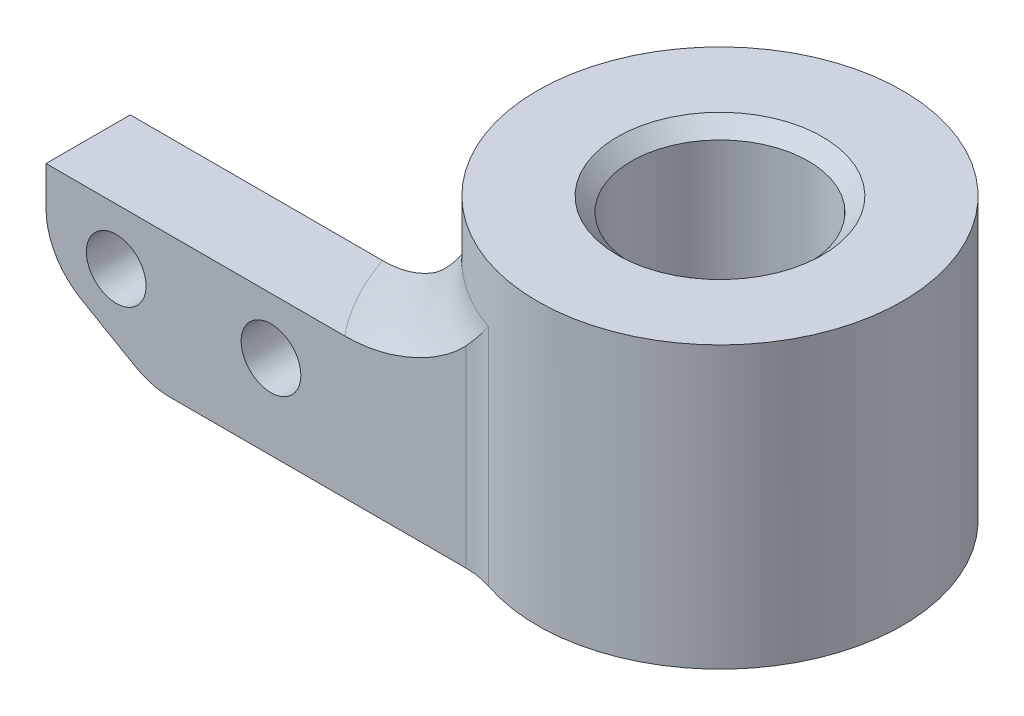
ISO-10303-21;
HEADER;
FILE_DESCRIPTION(('STEP AP214'),'2;1');
FILE_NAME('part.step','',(''),(''),'','','');
FILE_SCHEMA(('AUTOMOTIVE_DESIGN { 1 0 10303 214 1 1 1 1 }'));
ENDSEC;
DATA;
#1=APPLICATION_CONTEXT('core data for automotive mechanical design processes');
#2=APPLICATION_PROTOCOL_DEFINITION('international standard','automotive_design',2000,#1);
#3=PRODUCT_CONTEXT('',#1,'mechanical');
#4=PRODUCT('Part','Part','',(#3));
#5=PRODUCT_RELATED_PRODUCT_CATEGORY('part','',(#4));
#6=PRODUCT_DEFINITION_FORMATION('','',#4);
#7=PRODUCT_DEFINITION_CONTEXT('part definition',#1,'design');
#8=PRODUCT_DEFINITION('design','',#6,#7);
#9=PRODUCT_DEFINITION_SHAPE('','',#8);
#10=(LENGTH_UNIT() NAMED_UNIT(*) SI_UNIT(.MILLI.,.METRE.));
#11=(NAMED_UNIT(*) PLANE_ANGLE_UNIT() SI_UNIT($,.RADIAN.));
#12=(NAMED_UNIT(*) SI_UNIT($,.STERADIAN.) SOLID_ANGLE_UNIT());
#13=UNCERTAINTY_MEASURE_WITH_UNIT(LENGTH_MEASURE(1.E-05),#10,'distance_accuracy_value','');
#14=(GEOMETRIC_REPRESENTATION_CONTEXT(3) GLOBAL_UNCERTAINTY_ASSIGNED_CONTEXT((#13)) GLOBAL_UNIT_ASSIGNED_CONTEXT((#10,
#11,#12)) REPRESENTATION_CONTEXT('',''));
#15=CARTESIAN_POINT('',(0.,0.,0.));
#16=DIRECTION('',(0.,0.,1.));
#17=DIRECTION('',(1.,0.,0.));
#18=AXIS2_PLACEMENT_3D('',#15,#16,#17);
#19=CARTESIAN_POINT('',(0.,6.35,0.));
#20=DIRECTION('',(0.,-1.,0.));
#21=DIRECTION('',(0.,0.,-1.));
#22=AXIS2_PLACEMENT_3D('',#19,#20,#21);
#23=CYLINDRICAL_SURFACE('',#22,8.255);
#24=CARTESIAN_POINT('',(0.,6.35,0.));
#25=DIRECTION('',(0.,1.,0.));
#26=DIRECTION('',(0.,0.,1.));
#27=AXIS2_PLACEMENT_3D('',#24,#25,#26);
#28=CIRCLE('',#27,8.255);
#29=CARTESIAN_POINT('',(0.,6.35,8.255));
#30=VERTEX_POINT('',#29);
#31=EDGE_CURVE('E150',#30,#30,#28,.T.);
#32=ORIENTED_EDGE('',*,*,#31,.F.);
#33=EDGE_LOOP('',(#32));
#34=FACE_BOUND('',#33,.T.);
#35=CARTESIAN_POINT('',(0.,-6.35,0.));
#36=DIRECTION('',(0.,1.,0.));
#37=DIRECTION('',(0.,0.,1.));
#38=AXIS2_PLACEMENT_3D('',#35,#36,#37);
#39=CIRCLE('',#38,8.255);
#40=CARTESIAN_POINT('',(-2.64280024671641,-6.35,7.82052631578947));
#41=VERTEX_POINT('',#40);
#42=CARTESIAN_POINT('',(-7.9560767062388,-6.35,2.20133333333333));
#43=VERTEX_POINT('',#42);
#44=EDGE_CURVE('E134',#41,#43,#39,.T.);
#45=ORIENTED_EDGE('',*,*,#44,.T.);
#46=DIRECTION('',(0.,-1.,0.));
#47=VECTOR('',#46,1.);
#48=CARTESIAN_POINT('',(-7.9560767062388,6.35,2.20133333333333));
#49=LINE('',#48,#47);
#50=CARTESIAN_POINT('',(-7.9560767062388,3.81,2.20133333333333));
#51=VERTEX_POINT('',#50);
#52=EDGE_CURVE('E245',#43,#51,#49,.F.);
#53=ORIENTED_EDGE('',*,*,#52,.T.);
#54=CARTESIAN_POINT('',(0.,3.81,0.));
#55=DIRECTION('',(0.,-1.,0.));
#56=DIRECTION('',(1.,0.,0.));
#57=AXIS2_PLACEMENT_3D('',#54,#55,#56);
#58=CIRCLE('',#57,8.255);
#59=CARTESIAN_POINT('',(-2.64280024671641,3.81,7.82052631578947));
#60=VERTEX_POINT('',#59);
#61=EDGE_CURVE('E51',#51,#60,#58,.F.);
#62=ORIENTED_EDGE('',*,*,#61,.T.);
#63=DIRECTION('',(0.,-1.,0.));
#64=VECTOR('',#63,1.);
#65=CARTESIAN_POINT('',(-2.64280024671641,6.35,7.82052631578947));
#66=LINE('',#65,#64);
#67=EDGE_CURVE('E155',#60,#41,#66,.T.);
#68=ORIENTED_EDGE('',*,*,#67,.T.);
#69=EDGE_LOOP('',(#45,#53,#62,#68));
#70=FACE_BOUND('',#69,.T.);
#71=ADVANCED_FACE('F35',(#34,#70),#23,.T.);
#72=CARTESIAN_POINT('',(0.,6.35,0.));
#73=DIRECTION('',(0.,1.,0.));
#74=DIRECTION('',(0.,0.,1.));
#75=AXIS2_PLACEMENT_3D('',#72,#73,#74);
#76=PLANE('',#75);
#77=CARTESIAN_POINT('',(0.,6.35,0.));
#78=DIRECTION('',(0.,1.,0.));
#79=DIRECTION('',(0.,0.,1.));
#80=AXIS2_PLACEMENT_3D('',#77,#78,#79);
#81=CIRCLE('',#80,4.635);
#82=CARTESIAN_POINT('',(0.,6.35,4.635));
#83=VERTEX_POINT('',#82);
#84=EDGE_CURVE('E11',#83,#83,#81,.F.);
#85=ORIENTED_EDGE('',*,*,#84,.T.);
#86=EDGE_LOOP('',(#85));
#87=FACE_BOUND('',#86,.T.);
#88=ORIENTED_EDGE('',*,*,#31,.T.);
#89=EDGE_LOOP('',(#88));
#90=FACE_BOUND('',#89,.T.);
#91=ADVANCED_FACE('F234',(#87,#90),#76,.T.);
#92=CARTESIAN_POINT('',(0.,-6.35,0.));
#93=DIRECTION('',(0.,1.,0.));
#94=DIRECTION('',(0.,0.,1.));
#95=AXIS2_PLACEMENT_3D('',#92,#93,#94);
#96=PLANE('',#95);
#97=CARTESIAN_POINT('',(0.,-6.35,0.));
#98=DIRECTION('',(0.,1.,0.));
#99=DIRECTION('',(0.,0.,1.));
#100=AXIS2_PLACEMENT_3D('',#97,#98,#99);
#101=CIRCLE('',#100,4.635);
#102=CARTESIAN_POINT('',(0.,-6.35,4.635));
#103=VERTEX_POINT('',#102);
#104=EDGE_CURVE('E210',#103,#103,#101,.T.);
#105=ORIENTED_EDGE('',*,*,#104,.T.);
#106=EDGE_LOOP('',(#105));
#107=FACE_BOUND('',#106,.T.);
#108=DIRECTION('',(1.,0.,0.));
#109=VECTOR('',#108,1.);
#110=CARTESIAN_POINT('',(-22.86,-6.35,7.62));
#111=LINE('',#110,#109);
#112=CARTESIAN_POINT('',(-17.2467613140312,-6.35,7.62));
#113=VERTEX_POINT('',#112);
#114=CARTESIAN_POINT('',(-3.86255420673937,-6.35,7.62));
#115=VERTEX_POINT('',#114);
#116=EDGE_CURVE('E135',#113,#115,#111,.T.);
#117=ORIENTED_EDGE('',*,*,#116,.F.);
#118=DIRECTION('',(0.,0.,1.));
#119=VECTOR('',#118,1.);
#120=CARTESIAN_POINT('',(-17.2467613140312,-6.35,3.81));
#121=LINE('',#120,#119);
#122=CARTESIAN_POINT('',(-17.2467613140312,-6.35,3.81));
#123=VERTEX_POINT('',#122);
#124=EDGE_CURVE('E266',#113,#123,#121,.F.);
#125=ORIENTED_EDGE('',*,*,#124,.T.);
#126=DIRECTION('',(1.,0.,0.));
#127=VECTOR('',#126,1.);
#128=CARTESIAN_POINT('',(-22.86,-6.35,3.81));
#129=LINE('',#128,#127);
#130=CARTESIAN_POINT('',(-9.18008850719861,-6.35,3.81));
#131=VERTEX_POINT('',#130);
#132=EDGE_CURVE('E124',#123,#131,#129,.T.);
#133=ORIENTED_EDGE('',*,*,#132,.T.);
#134=CARTESIAN_POINT('',(-9.18008850719861,-6.35,2.54));
#135=DIRECTION('',(0.,1.,0.));
#136=DIRECTION('',(0.,0.,1.));
#137=AXIS2_PLACEMENT_3D('',#134,#135,#136);
#138=CIRCLE('',#137,1.27);
#139=EDGE_CURVE('E59',#131,#43,#138,.T.);
#140=ORIENTED_EDGE('',*,*,#139,.T.);
#141=ORIENTED_EDGE('',*,*,#44,.F.);
#142=CARTESIAN_POINT('',(-3.86255420673937,-6.35,11.43));
#143=DIRECTION('',(0.,1.,0.));
#144=DIRECTION('',(0.,0.,1.));
#145=AXIS2_PLACEMENT_3D('',#142,#143,#144);
#146=CIRCLE('',#145,3.81);
#147=EDGE_CURVE('E162',#41,#115,#146,.T.);
#148=ORIENTED_EDGE('',*,*,#147,.T.);
#149=EDGE_LOOP('',(#117,#125,#133,#140,#141,#148));
#150=FACE_BOUND('',#149,.T.);
#151=ADVANCED_FACE('F239',(#107,#150),#96,.F.);
#152=CARTESIAN_POINT('',(0.,0.,7.62));
#153=DIRECTION('',(0.,0.,1.));
#154=DIRECTION('',(1.,0.,0.));
#155=AXIS2_PLACEMENT_3D('',#152,#153,#154);
#156=PLANE('',#155);
#157=CARTESIAN_POINT('',(-19.685,-2.54,7.62));
#158=DIRECTION('',(0.,0.,1.));
#159=DIRECTION('',(1.,0.,0.));
#160=AXIS2_PLACEMENT_3D('',#157,#158,#159);
#161=CIRCLE('',#160,1.35);
#162=CARTESIAN_POINT('',(-18.335,-2.54,7.62));
#163=VERTEX_POINT('',#162);
#164=EDGE_CURVE('E277',#163,#163,#161,.T.);
#165=ORIENTED_EDGE('',*,*,#164,.F.);
#166=EDGE_LOOP('',(#165));
#167=FACE_BOUND('',#166,.T.);
#168=CARTESIAN_POINT('',(-12.685,-2.54,7.62));
#169=DIRECTION('',(0.,0.,1.));
#170=DIRECTION('',(1.,0.,0.));
#171=AXIS2_PLACEMENT_3D('',#168,#169,#170);
#172=CIRCLE('',#171,1.35);
#173=CARTESIAN_POINT('',(-11.335,-2.54,7.62));
#174=VERTEX_POINT('',#173);
#175=EDGE_CURVE('E276',#174,#174,#172,.T.);
#176=ORIENTED_EDGE('',*,*,#175,.F.);
#177=EDGE_LOOP('',(#176));
#178=FACE_BOUND('',#177,.T.);
#179=DIRECTION('',(-0.86602540378444,0.499999999999999,0.));
#180=VECTOR('',#179,1.);
#181=CARTESIAN_POINT('',(-7.27400565701556,-12.5989473724944,7.62));
#182=LINE('',#181,#180);
#183=CARTESIAN_POINT('',(-21.2725,-4.51691289532294,7.62));
#184=VERTEX_POINT('',#183);
#185=CARTESIAN_POINT('',(-18.8342613140312,-5.92463065701559,7.62));
#186=VERTEX_POINT('',#185);
#187=EDGE_CURVE('E269',#184,#186,#182,.F.);
#188=ORIENTED_EDGE('',*,*,#187,.T.);
#189=CARTESIAN_POINT('',(-17.2467613140312,-3.175,7.62));
#190=DIRECTION('',(0.,0.,1.));
#191=DIRECTION('',(1.,0.,0.));
#192=AXIS2_PLACEMENT_3D('',#189,#190,#191);
#193=CIRCLE('',#192,3.175);
#194=EDGE_CURVE('E254',#186,#113,#193,.T.);
#195=ORIENTED_EDGE('',*,*,#194,.T.);
#196=ORIENTED_EDGE('',*,*,#116,.T.);
#197=DIRECTION('',(0.,-1.,0.));
#198=VECTOR('',#197,1.);
#199=CARTESIAN_POINT('',(-3.86255420673937,0.,7.62));
#200=LINE('',#199,#198);
#201=CARTESIAN_POINT('',(-3.86255420673937,2.35673569420793,7.62));
#202=VERTEX_POINT('',#201);
#203=EDGE_CURVE('E158',#115,#202,#200,.F.);
#204=ORIENTED_EDGE('',*,*,#203,.T.);
#205=CARTESIAN_POINT('',(-3.86255420673937,2.35673569420793,7.62));
#206=CARTESIAN_POINT('',(-3.9169831990408,2.2971381978063,7.62));
#207=CARTESIAN_POINT('',(-3.97298992862896,2.2390180902316,7.62));
#208=CARTESIAN_POINT('',(-4.08766957179127,2.12552688536647,7.62));
#209=CARTESIAN_POINT('',(-4.14634106570247,2.07015435644666,7.62));
#210=CARTESIAN_POINT('',(-4.26580887261683,1.96199019341464,7.62));
#211=CARTESIAN_POINT('',(-4.32660106324882,1.90919398364485,7.62));
#212=CARTESIAN_POINT('',(-4.45011906271745,1.80590071481169,7.62));
#213=CARTESIAN_POINT('',(-4.51284520202756,1.75540405238811,7.62));
#214=CARTESIAN_POINT('',(-4.70401550044421,1.60680499587331,7.62));
#215=CARTESIAN_POINT('',(-4.83502108113584,1.51197797120408,7.62));
#216=CARTESIAN_POINT('',(-5.10259956980563,1.33038858512603,7.62));
#217=CARTESIAN_POINT('',(-5.23917663791268,1.24363241471198,7.62));
#218=CARTESIAN_POINT('',(-5.58384628908694,1.03819313260789,7.62));
#219=CARTESIAN_POINT('',(-5.79475980502617,0.924207441701971,7.62));
#220=CARTESIAN_POINT('',(-6.22520992290418,0.713872558578891,7.62));
#221=CARTESIAN_POINT('',(-6.44474753964111,0.61752544948996,7.62));
#222=CARTESIAN_POINT('',(-6.89087404326686,0.443778398324456,7.62));
#223=CARTESIAN_POINT('',(-7.11745252106657,0.366351858440535,7.62));
#224=CARTESIAN_POINT('',(-7.57651141256675,0.232040174566512,7.62));
#225=CARTESIAN_POINT('',(-7.80898813212443,0.175142497194473,7.62));
#226=CARTESIAN_POINT('',(-8.25958469451825,0.0875928424416338,7.62));
#227=CARTESIAN_POINT('',(-8.47736249903,0.0552033029189263,7.62));
#228=CARTESIAN_POINT('',(-8.91474266594692,0.0114273708302766,7.62));
#229=CARTESIAN_POINT('',(-9.13434268153412,1.72229617420266E-05,7.62));
#230=CARTESIAN_POINT('',(-9.35413411278671,0.,7.62));
#231=B_SPLINE_CURVE_WITH_KNOTS('',3,(#205,#206,#207,#208,#209,#210,#211,#212,#213,#214,#215,
#216,#217,#218,#219,#220,#221,#222,#223,#224,#225,#226,#227,#228,#229,#230),.UNSPECIFIED.,.F.,
.F.,(4,2,2,2,2,2,2,2,2,2,2,2,4),(0.,0.242066781590607,0.484006080212037,0.725498756891075,
0.967032931121158,1.45182885537213,1.9369936425708,2.65535581558041,3.37380277298696,
4.09123387912683,4.80822623156173,5.46777336398729,6.12657321957954),.UNSPECIFIED.);
#232=CARTESIAN_POINT('',(-9.35413411278671,0.,7.62));
#233=VERTEX_POINT('',#232);
#234=EDGE_CURVE('E121',#202,#233,#231,.T.);
#235=ORIENTED_EDGE('',*,*,#234,.T.);
#236=DIRECTION('',(-1.,0.,0.));
#237=VECTOR('',#236,1.);
#238=CARTESIAN_POINT('',(-22.86,0.,7.62));
#239=LINE('',#238,#237);
#240=CARTESIAN_POINT('',(-22.86,0.,7.62));
#241=VERTEX_POINT('',#240);
#242=EDGE_CURVE('E114',#233,#241,#239,.T.);
#243=ORIENTED_EDGE('',*,*,#242,.T.);
#244=DIRECTION('',(0.,-1.,0.));
#245=VECTOR('',#244,1.);
#246=CARTESIAN_POINT('',(-22.86,0.,7.62));
#247=LINE('',#246,#245);
#248=CARTESIAN_POINT('',(-22.86,-1.76728223830735,7.62));
#249=VERTEX_POINT('',#248);
#250=EDGE_CURVE('E119',#241,#249,#247,.T.);
#251=ORIENTED_EDGE('',*,*,#250,.T.);
#252=CARTESIAN_POINT('',(-19.685,-1.76728223830735,7.62));
#253=DIRECTION('',(0.,0.,1.));
#254=DIRECTION('',(1.,0.,0.));
#255=AXIS2_PLACEMENT_3D('',#252,#253,#254);
#256=CIRCLE('',#255,3.175);
#257=EDGE_CURVE('E256',#249,#184,#256,.T.);
#258=ORIENTED_EDGE('',*,*,#257,.T.);
#259=EDGE_LOOP('',(#188,#195,#196,#204,#235,#243,#251,#258));
#260=FACE_BOUND('',#259,.T.);
#261=ADVANCED_FACE('F117',(#167,#178,#260),#156,.T.);
#262=CARTESIAN_POINT('',(0.,0.,3.81));
#263=DIRECTION('',(0.,0.,1.));
#264=DIRECTION('',(1.,0.,0.));
#265=AXIS2_PLACEMENT_3D('',#262,#263,#264);
#266=PLANE('',#265);
#267=CARTESIAN_POINT('',(-19.685,-2.54,3.81));
#268=DIRECTION('',(0.,0.,1.));
#269=DIRECTION('',(1.,0.,0.));
#270=AXIS2_PLACEMENT_3D('',#267,#268,#269);
#271=CIRCLE('',#270,1.35);
#272=CARTESIAN_POINT('',(-18.335,-2.54,3.81));
#273=VERTEX_POINT('',#272);
#274=EDGE_CURVE('E274',#273,#273,#271,.T.);
#275=ORIENTED_EDGE('',*,*,#274,.T.);
#276=EDGE_LOOP('',(#275));
#277=FACE_BOUND('',#276,.T.);
#278=CARTESIAN_POINT('',(-12.685,-2.54,3.81));
#279=DIRECTION('',(0.,0.,1.));
#280=DIRECTION('',(1.,0.,0.));
#281=AXIS2_PLACEMENT_3D('',#278,#279,#280);
#282=CIRCLE('',#281,1.35);
#283=CARTESIAN_POINT('',(-11.335,-2.54,3.81));
#284=VERTEX_POINT('',#283);
#285=EDGE_CURVE('E278',#284,#284,#282,.T.);
#286=ORIENTED_EDGE('',*,*,#285,.T.);
#287=EDGE_LOOP('',(#286));
#288=FACE_BOUND('',#287,.T.);
#289=CARTESIAN_POINT('',(-11.4476252995982,0.,3.81));
#290=CARTESIAN_POINT('',(-11.3266779201208,-8.28739725339493E-06,3.81));
#291=CARTESIAN_POINT('',(-11.2057436325186,0.00518481252615767,3.81));
#292=CARTESIAN_POINT('',(-10.9647672254026,0.0258055824831192,3.81));
#293=CARTESIAN_POINT('',(-10.8447249783481,0.0412317598072477,3.81));
#294=CARTESIAN_POINT('',(-10.6064194055675,0.0821408687942385,3.81));
#295=CARTESIAN_POINT('',(-10.4881552629102,0.107619025897215,3.81));
#296=CARTESIAN_POINT('',(-10.2542065504931,0.168382985068926,3.81));
#297=CARTESIAN_POINT('',(-10.1385220428367,0.203669022982689,3.81));
#298=CARTESIAN_POINT('',(-9.79653901476809,0.323884598522303,3.81));
#299=CARTESIAN_POINT('',(-9.57509959242248,0.423208189201946,3.81));
#300=CARTESIAN_POINT('',(-9.15212091013672,0.65754476827388,3.81));
#301=CARTESIAN_POINT('',(-8.95058363546316,0.792561312157815,3.81));
#302=CARTESIAN_POINT('',(-8.5738750239385,1.09520780357152,3.81));
#303=CARTESIAN_POINT('',(-8.39865975951581,1.26278231996581,3.81));
#304=CARTESIAN_POINT('',(-8.16065526748921,1.53552471259873,3.81));
#305=CARTESIAN_POINT('',(-8.08541718886761,1.63006873921489,3.81));
#306=CARTESIAN_POINT('',(-7.94406289481383,1.8257224913201,3.81));
#307=CARTESIAN_POINT('',(-7.87794160290374,1.9268285164004,3.81));
#308=CARTESIAN_POINT('',(-7.75961637477253,2.12824247834426,3.81));
#309=CARTESIAN_POINT('',(-7.70679225569345,2.22818668289593,3.81));
#310=CARTESIAN_POINT('',(-7.61062950869028,2.43248611026546,3.81));
#311=CARTESIAN_POINT('',(-7.56728560034117,2.53683883871212,3.81));
#312=CARTESIAN_POINT('',(-7.49077677275583,2.74900246002672,3.81));
#313=CARTESIAN_POINT('',(-7.45759350549942,2.85680672646183,3.81));
#314=CARTESIAN_POINT('',(-7.40186941555012,3.0750794145532,3.81));
#315=CARTESIAN_POINT('',(-7.37932213110951,3.18554617565318,3.81));
#316=CARTESIAN_POINT('',(-7.34929142980726,3.38176363443422,3.81));
#317=CARTESIAN_POINT('',(-7.33950450379724,3.46716829910686,3.81));
#318=CARTESIAN_POINT('',(-7.32644563280599,3.63837778977342,3.81));
#319=CARTESIAN_POINT('',(-7.32316643448024,3.72418206329126,3.81));
#320=CARTESIAN_POINT('',(-7.32317724761596,3.81,3.81));
#321=B_SPLINE_CURVE_WITH_KNOTS('',3,(#289,#290,#291,#292,#293,#294,#295,#296,#297,#298,#299,
#300,#301,#302,#303,#304,#305,#306,#307,#308,#309,#310,#311,#312,#313,#314,#315,#316,#317,#318,
#319,#320),.UNSPECIFIED.,.F.,.F.,(4,2,2,2,2,2,2,2,2,2,2,2,2,2,2,4),(0.,0.36270982293326,
0.725366748646386,1.08785162401273,1.45034521661929,2.17469674329703,2.89912045220258,
3.622321443385,3.98437941704448,4.34623496557016,4.68491151511742,5.02339894056952,
5.36127147297307,5.69893847026607,5.95659142957481,6.21395705393125),.UNSPECIFIED.);
#322=CARTESIAN_POINT('',(-11.4476252995982,0.,3.81));
#323=VERTEX_POINT('',#322);
#324=CARTESIAN_POINT('',(-9.18008850719861,0.648102828921246,3.81));
#325=VERTEX_POINT('',#324);
#326=EDGE_CURVE('E165',#323,#325,#321,.T.);
#327=ORIENTED_EDGE('',*,*,#326,.T.);
#328=DIRECTION('',(0.,1.,0.));
#329=VECTOR('',#328,1.);
#330=CARTESIAN_POINT('',(-9.18008850719861,-6.35,3.81));
#331=LINE('',#330,#329);
#332=EDGE_CURVE('E250',#325,#131,#331,.F.);
#333=ORIENTED_EDGE('',*,*,#332,.T.);
#334=ORIENTED_EDGE('',*,*,#132,.F.);
#335=CARTESIAN_POINT('',(-17.2467613140312,-3.175,3.81));
#336=DIRECTION('',(0.,0.,1.));
#337=DIRECTION('',(1.,0.,0.));
#338=AXIS2_PLACEMENT_3D('',#335,#336,#337);
#339=CIRCLE('',#338,3.175);
#340=CARTESIAN_POINT('',(-18.8342613140312,-5.92463065701559,3.81));
#341=VERTEX_POINT('',#340);
#342=EDGE_CURVE('E262',#123,#341,#339,.F.);
#343=ORIENTED_EDGE('',*,*,#342,.T.);
#344=DIRECTION('',(0.86602540378444,-0.499999999999999,0.));
#345=VECTOR('',#344,1.);
#346=CARTESIAN_POINT('',(-18.0975,-6.35,3.81));
#347=LINE('',#346,#345);
#348=CARTESIAN_POINT('',(-21.2725,-4.51691289532294,3.81));
#349=VERTEX_POINT('',#348);
#350=EDGE_CURVE('E271',#341,#349,#347,.F.);
#351=ORIENTED_EDGE('',*,*,#350,.T.);
#352=CARTESIAN_POINT('',(-19.685,-1.76728223830735,3.81));
#353=DIRECTION('',(0.,0.,1.));
#354=DIRECTION('',(1.,0.,0.));
#355=AXIS2_PLACEMENT_3D('',#352,#353,#354);
#356=CIRCLE('',#355,3.175);
#357=CARTESIAN_POINT('',(-22.86,-1.76728223830735,3.81));
#358=VERTEX_POINT('',#357);
#359=EDGE_CURVE('E264',#349,#358,#356,.F.);
#360=ORIENTED_EDGE('',*,*,#359,.T.);
#361=DIRECTION('',(0.,-1.,0.));
#362=VECTOR('',#361,1.);
#363=CARTESIAN_POINT('',(-22.86,0.,3.81));
#364=LINE('',#363,#362);
#365=CARTESIAN_POINT('',(-22.86,0.,3.81));
#366=VERTEX_POINT('',#365);
#367=EDGE_CURVE('E146',#366,#358,#364,.T.);
#368=ORIENTED_EDGE('',*,*,#367,.F.);
#369=DIRECTION('',(-1.,0.,0.));
#370=VECTOR('',#369,1.);
#371=CARTESIAN_POINT('',(-22.86,0.,3.81));
#372=LINE('',#371,#370);
#373=EDGE_CURVE('E130',#323,#366,#372,.T.);
#374=ORIENTED_EDGE('',*,*,#373,.F.);
#375=EDGE_LOOP('',(#327,#333,#334,#343,#351,#360,#368,#374));
#376=FACE_BOUND('',#375,.T.);
#377=ADVANCED_FACE('F180',(#277,#288,#376),#266,.F.);
#378=CARTESIAN_POINT('',(-22.86,0.,7.62));
#379=DIRECTION('',(0.,-1.,0.));
#380=DIRECTION('',(1.,0.,0.));
#381=AXIS2_PLACEMENT_3D('',#378,#379,#380);
#382=PLANE('',#381);
#383=ORIENTED_EDGE('',*,*,#242,.F.);
#384=CARTESIAN_POINT('',(0.,0.,0.));
#385=DIRECTION('',(0.,-1.,0.));
#386=DIRECTION('',(1.,0.,0.));
#387=AXIS2_PLACEMENT_3D('',#384,#385,#386);
#388=CIRCLE('',#387,12.065);
#389=EDGE_CURVE('E160',#233,#323,#388,.T.);
#390=ORIENTED_EDGE('',*,*,#389,.T.);
#391=ORIENTED_EDGE('',*,*,#373,.T.);
#392=DIRECTION('',(0.,0.,-1.));
#393=VECTOR('',#392,1.);
#394=CARTESIAN_POINT('',(-22.86,0.,7.62));
#395=LINE('',#394,#393);
#396=EDGE_CURVE('E127',#241,#366,#395,.T.);
#397=ORIENTED_EDGE('',*,*,#396,.F.);
#398=EDGE_LOOP('',(#383,#390,#391,#397));
#399=FACE_BOUND('',#398,.T.);
#400=ADVANCED_FACE('F128',(#399),#382,.F.);
#401=CARTESIAN_POINT('',(-22.86,0.,7.62));
#402=DIRECTION('',(1.,0.,0.));
#403=DIRECTION('',(0.,0.,-1.));
#404=AXIS2_PLACEMENT_3D('',#401,#402,#403);
#405=PLANE('',#404);
#406=ORIENTED_EDGE('',*,*,#367,.T.);
#407=DIRECTION('',(0.,0.,-1.));
#408=VECTOR('',#407,1.);
#409=CARTESIAN_POINT('',(-22.86,-1.76728223830735,7.62));
#410=LINE('',#409,#408);
#411=EDGE_CURVE('E140',#358,#249,#410,.F.);
#412=ORIENTED_EDGE('',*,*,#411,.T.);
#413=ORIENTED_EDGE('',*,*,#250,.F.);
#414=ORIENTED_EDGE('',*,*,#396,.T.);
#415=EDGE_LOOP('',(#406,#412,#413,#414));
#416=FACE_BOUND('',#415,.T.);
#417=ADVANCED_FACE('F138',(#416),#405,.F.);
#418=CARTESIAN_POINT('',(0.,6.35,0.));
#419=DIRECTION('',(0.,1.,0.));
#420=DIRECTION('',(0.,0.,1.));
#421=AXIS2_PLACEMENT_3D('',#418,#419,#420);
#422=CYLINDRICAL_SURFACE('',#421,4.);
#423=CARTESIAN_POINT('',(0.,-5.71499999999999,0.));
#424=DIRECTION('',(0.,1.,0.));
#425=DIRECTION('',(0.,0.,1.));
#426=AXIS2_PLACEMENT_3D('',#423,#424,#425);
#427=CIRCLE('',#426,4.);
#428=CARTESIAN_POINT('',(0.,-5.71499999999999,4.));
#429=VERTEX_POINT('',#428);
#430=EDGE_CURVE('E44',#429,#429,#427,.F.);
#431=ORIENTED_EDGE('',*,*,#430,.T.);
#432=EDGE_LOOP('',(#431));
#433=FACE_BOUND('',#432,.T.);
#434=CARTESIAN_POINT('',(0.,5.715,0.));
#435=DIRECTION('',(0.,1.,0.));
#436=DIRECTION('',(0.,0.,1.));
#437=AXIS2_PLACEMENT_3D('',#434,#435,#436);
#438=CIRCLE('',#437,4.);
#439=CARTESIAN_POINT('',(0.,5.715,4.));
#440=VERTEX_POINT('',#439);
#441=EDGE_CURVE('E447',#440,#440,#438,.T.);
#442=ORIENTED_EDGE('',*,*,#441,.T.);
#443=EDGE_LOOP('',(#442));
#444=FACE_BOUND('',#443,.T.);
#445=ADVANCED_FACE('F189',(#433,#444),#422,.F.);
#446=CARTESIAN_POINT('',(0.,3.81,0.));
#447=DIRECTION('',(0.,-1.,0.));
#448=DIRECTION('',(1.,0.,0.));
#449=AXIS2_PLACEMENT_3D('',#446,#447,#448);
#450=TOROIDAL_SURFACE('',#449,12.065,3.81);
#451=ORIENTED_EDGE('',*,*,#389,.F.);
#452=ORIENTED_EDGE('',*,*,#234,.F.);
#453=CARTESIAN_POINT('',(-3.86255420673937,2.35673569420793,7.62));
#454=CARTESIAN_POINT('',(-3.75555109871746,2.47399371269304,7.62003731183255));
#455=CARTESIAN_POINT('',(-3.65004854523244,2.59256703669644,7.62450786763699));
#456=CARTESIAN_POINT('',(-3.44193676264806,2.8316311261851,7.64183984013418));
#457=CARTESIAN_POINT('',(-3.33932752186652,2.95212188392535,7.65470122294262));
#458=CARTESIAN_POINT('',(-3.13744777298033,3.19364577179122,7.68824716412742));
#459=CARTESIAN_POINT('',(-3.03816206343446,3.31467232261211,7.70888851351656));
#460=CARTESIAN_POINT('',(-2.84224009706757,3.55730002443671,7.7577726710824));
#461=CARTESIAN_POINT('',(-2.74560319725572,3.67890102743908,7.78601361614691));
#462=CARTESIAN_POINT('',(-2.64777065196959,3.80365835211539,7.81884952424572));
#463=CARTESIAN_POINT('',(-2.64528501056367,3.80682918380232,7.81968664164334));
#464=CARTESIAN_POINT('',(-2.64280024671641,3.81,7.82052631578947));
#465=B_SPLINE_CURVE_WITH_KNOTS('',3,(#453,#454,#455,#456,#457,#458,#459,#460,#461,#462,#463,
#464),.UNSPECIFIED.,.F.,.F.,(4,2,2,2,2,4),(0.,0.476096848484705,0.952191774380173,
1.42568058432971,1.89905341964113,1.91139846180452),.UNSPECIFIED.);
#466=EDGE_CURVE('E147',#60,#202,#465,.F.);
#467=ORIENTED_EDGE('',*,*,#466,.F.);
#468=ORIENTED_EDGE('',*,*,#61,.F.);
#469=CARTESIAN_POINT('',(-9.18008850719861,0.648102828921246,3.81));
#470=CARTESIAN_POINT('',(-9.13354145124173,0.676981613010318,3.81000428231056));
#471=CARTESIAN_POINT('',(-9.08790906542653,0.707237315358909,3.80744298951945));
#472=CARTESIAN_POINT('',(-8.9989838011731,0.770167736841327,3.79781260211698));
#473=CARTESIAN_POINT('',(-8.95568597801985,0.802836965427747,3.79075347650094));
#474=CARTESIAN_POINT('',(-8.87228635348112,0.869942500894387,3.77286453636615));
#475=CARTESIAN_POINT('',(-8.83214983629748,0.904349697052384,3.76208586482414));
#476=CARTESIAN_POINT('',(-8.75462670451918,0.975082005417814,3.73730490779701));
#477=CARTESIAN_POINT('',(-8.7172418653001,1.01140833032806,3.72330056476205));
#478=CARTESIAN_POINT('',(-8.63702171547208,1.09432880556822,3.68904169522174));
#479=CARTESIAN_POINT('',(-8.59492821044515,1.14135311923659,3.66809077652278));
#480=CARTESIAN_POINT('',(-8.51510067848753,1.23752457708846,3.62295641106678));
#481=CARTESIAN_POINT('',(-8.4773699396439,1.28667328453095,3.59877055546178));
#482=CARTESIAN_POINT('',(-8.37024048838776,1.43724382532986,3.52223501041556));
#483=CARTESIAN_POINT('',(-8.30729388546897,1.54138016096009,3.46608752747742));
#484=CARTESIAN_POINT('',(-8.20978574487292,1.72989725893149,3.36174995951482));
#485=CARTESIAN_POINT('',(-8.17202528825403,1.8133248365951,3.31469235233595));
#486=CARTESIAN_POINT('',(-8.10492356318973,1.98240534275666,3.21849738802061));
#487=CARTESIAN_POINT('',(-8.07558689951785,2.0680594605774,3.1693589101749));
#488=CARTESIAN_POINT('',(-8.02460082124149,2.24104278038141,3.06997210171882));
#489=CARTESIAN_POINT('',(-8.00295668543423,2.32837308945834,3.01972303401531));
#490=CARTESIAN_POINT('',(-7.96672683625998,2.50423021253861,2.91884604400576));
#491=CARTESIAN_POINT('',(-7.95213982646832,2.59275680370587,2.86821819302047));
#492=CARTESIAN_POINT('',(-7.92909755779159,2.77372697894939,2.76537137216258));
#493=CARTESIAN_POINT('',(-7.92086724738675,2.86620151998364,2.71315672787375));
#494=CARTESIAN_POINT('',(-7.91090808555151,3.05182695888888,2.60929932390451));
#495=CARTESIAN_POINT('',(-7.90918158702006,3.14497808932287,2.55765677792874));
#496=CARTESIAN_POINT('',(-7.91322393727623,3.42470416986108,2.40434327195199));
#497=CARTESIAN_POINT('',(-7.92815889605156,3.61202259721305,2.30401644718625));
#498=CARTESIAN_POINT('',(-7.95504202859242,3.80275082500168,2.20508975300103));
#499=CARTESIAN_POINT('',(-7.95555722411496,3.80637545722076,2.20321092223402));
#500=CARTESIAN_POINT('',(-7.9560767062388,3.81,2.20133333333333));
#501=B_SPLINE_CURVE_WITH_KNOTS('',3,(#469,#470,#471,#472,#473,#474,#475,#476,#477,#478,#479,
#480,#481,#482,#483,#484,#485,#486,#487,#488,#489,#490,#491,#492,#493,#494,#495,#496,#497,#498,
#499,#500),.UNSPECIFIED.,.F.,.F.,(4,2,2,2,2,2,2,2,2,2,2,2,2,2,2,4),(0.,0.164175303779154,
0.327987989258686,0.489632556070671,0.651380517586441,0.850573842248886,1.04991632773627,
1.45036017355045,1.7588707233629,2.06754959740513,2.37643988716051,2.68527341086245,
3.00459020716302,3.32402251234612,3.96125964824525,3.97360469506613),.UNSPECIFIED.);
#502=EDGE_CURVE('E202',#51,#325,#501,.F.);
#503=ORIENTED_EDGE('',*,*,#502,.T.);
#504=ORIENTED_EDGE('',*,*,#326,.F.);
#505=EDGE_LOOP('',(#451,#452,#467,#468,#503,#504));
#506=FACE_BOUND('',#505,.T.);
#507=ADVANCED_FACE('F183',(#506),#450,.F.);
#508=CARTESIAN_POINT('',(-3.86255420673937,6.35,11.43));
#509=DIRECTION('',(0.,-1.,0.));
#510=DIRECTION('',(0.,0.,-1.));
#511=AXIS2_PLACEMENT_3D('',#508,#509,#510);
#512=CYLINDRICAL_SURFACE('',#511,3.81);
#513=ORIENTED_EDGE('',*,*,#466,.T.);
#514=ORIENTED_EDGE('',*,*,#203,.F.);
#515=ORIENTED_EDGE('',*,*,#147,.F.);
#516=ORIENTED_EDGE('',*,*,#67,.F.);
#517=EDGE_LOOP('',(#513,#514,#515,#516));
#518=FACE_BOUND('',#517,.T.);
#519=ADVANCED_FACE('F188',(#518),#512,.F.);
#520=CARTESIAN_POINT('',(-12.685,-2.54,7.62));
#521=DIRECTION('',(0.,0.,1.));
#522=DIRECTION('',(1.,0.,0.));
#523=AXIS2_PLACEMENT_3D('',#520,#521,#522);
#524=CYLINDRICAL_SURFACE('',#523,1.35);
#525=ORIENTED_EDGE('',*,*,#175,.T.);
#526=EDGE_LOOP('',(#525));
#527=FACE_BOUND('',#526,.T.);
#528=ORIENTED_EDGE('',*,*,#285,.F.);
#529=EDGE_LOOP('',(#528));
#530=FACE_BOUND('',#529,.T.);
#531=ADVANCED_FACE('F306',(#527,#530),#524,.F.);
#532=CARTESIAN_POINT('',(-19.685,-2.54,7.62));
#533=DIRECTION('',(0.,0.,1.));
#534=DIRECTION('',(1.,0.,0.));
#535=AXIS2_PLACEMENT_3D('',#532,#533,#534);
#536=CYLINDRICAL_SURFACE('',#535,1.35);
#537=ORIENTED_EDGE('',*,*,#164,.T.);
#538=EDGE_LOOP('',(#537));
#539=FACE_BOUND('',#538,.T.);
#540=ORIENTED_EDGE('',*,*,#274,.F.);
#541=EDGE_LOOP('',(#540));
#542=FACE_BOUND('',#541,.T.);
#543=ADVANCED_FACE('F290',(#539,#542),#536,.F.);
#544=CARTESIAN_POINT('',(-18.0975,-6.35,0.));
#545=DIRECTION('',(0.499999999999999,0.86602540378444,0.));
#546=DIRECTION('',(0.,0.,-1.));
#547=AXIS2_PLACEMENT_3D('',#544,#545,#546);
#548=PLANE('',#547);
#549=ORIENTED_EDGE('',*,*,#350,.F.);
#550=DIRECTION('',(0.,0.,-1.));
#551=VECTOR('',#550,1.);
#552=CARTESIAN_POINT('',(-18.8342613140312,-5.92463065701559,7.62));
#553=LINE('',#552,#551);
#554=EDGE_CURVE('E258',#341,#186,#553,.F.);
#555=ORIENTED_EDGE('',*,*,#554,.T.);
#556=ORIENTED_EDGE('',*,*,#187,.F.);
#557=DIRECTION('',(0.,0.,1.));
#558=VECTOR('',#557,1.);
#559=CARTESIAN_POINT('',(-21.2725,-4.51691289532294,3.81));
#560=LINE('',#559,#558);
#561=EDGE_CURVE('E260',#184,#349,#560,.F.);
#562=ORIENTED_EDGE('',*,*,#561,.T.);
#563=EDGE_LOOP('',(#549,#555,#556,#562));
#564=FACE_BOUND('',#563,.T.);
#565=ADVANCED_FACE('F310',(#564),#548,.F.);
#566=CARTESIAN_POINT('',(-17.2467613140312,-3.175,0.));
#567=DIRECTION('',(0.,0.,-1.));
#568=DIRECTION('',(-1.,0.,0.));
#569=AXIS2_PLACEMENT_3D('',#566,#567,#568);
#570=CYLINDRICAL_SURFACE('',#569,3.175);
#571=ORIENTED_EDGE('',*,*,#194,.F.);
#572=ORIENTED_EDGE('',*,*,#554,.F.);
#573=ORIENTED_EDGE('',*,*,#342,.F.);
#574=ORIENTED_EDGE('',*,*,#124,.F.);
#575=EDGE_LOOP('',(#571,#572,#573,#574));
#576=FACE_BOUND('',#575,.T.);
#577=ADVANCED_FACE('F314',(#576),#570,.T.);
#578=CARTESIAN_POINT('',(-19.685,-1.76728223830735,7.62));
#579=DIRECTION('',(0.,0.,1.));
#580=DIRECTION('',(1.,0.,0.));
#581=AXIS2_PLACEMENT_3D('',#578,#579,#580);
#582=CYLINDRICAL_SURFACE('',#581,3.175);
#583=ORIENTED_EDGE('',*,*,#359,.F.);
#584=ORIENTED_EDGE('',*,*,#561,.F.);
#585=ORIENTED_EDGE('',*,*,#257,.F.);
#586=ORIENTED_EDGE('',*,*,#411,.F.);
#587=EDGE_LOOP('',(#583,#584,#585,#586));
#588=FACE_BOUND('',#587,.T.);
#589=ADVANCED_FACE('F218',(#588),#582,.T.);
#590=CARTESIAN_POINT('',(-9.18008850719861,6.35,2.54));
#591=DIRECTION('',(0.,-1.,0.));
#592=DIRECTION('',(0.,0.,-1.));
#593=AXIS2_PLACEMENT_3D('',#590,#591,#592);
#594=CYLINDRICAL_SURFACE('',#593,1.27);
#595=ORIENTED_EDGE('',*,*,#502,.F.);
#596=ORIENTED_EDGE('',*,*,#52,.F.);
#597=ORIENTED_EDGE('',*,*,#139,.F.);
#598=ORIENTED_EDGE('',*,*,#332,.F.);
#599=EDGE_LOOP('',(#595,#596,#597,#598));
#600=FACE_BOUND('',#599,.T.);
#601=ADVANCED_FACE('F213',(#600),#594,.F.);
#602=CARTESIAN_POINT('',(0.,-6.35,0.));
#603=DIRECTION('',(0.,-1.,0.));
#604=DIRECTION('',(0.,0.,-1.));
#605=AXIS2_PLACEMENT_3D('',#602,#603,#604);
#606=CONICAL_SURFACE('',#605,4.635,0.785398163397448);
#607=ORIENTED_EDGE('',*,*,#430,.F.);
#608=EDGE_LOOP('',(#607));
#609=FACE_BOUND('',#608,.T.);
#610=ORIENTED_EDGE('',*,*,#104,.F.);
#611=EDGE_LOOP('',(#610));
#612=FACE_BOUND('',#611,.T.);
#613=ADVANCED_FACE('F217',(#609,#612),#606,.F.);
#614=CARTESIAN_POINT('',(0.,5.715,0.));
#615=DIRECTION('',(0.,1.,0.));
#616=DIRECTION('',(0.,0.,1.));
#617=AXIS2_PLACEMENT_3D('',#614,#615,#616);
#618=CONICAL_SURFACE('',#617,4.,0.78539816339745);
#619=ORIENTED_EDGE('',*,*,#84,.F.);
#620=EDGE_LOOP('',(#619));
#621=FACE_BOUND('',#620,.T.);
#622=ORIENTED_EDGE('',*,*,#441,.F.);
#623=EDGE_LOOP('',(#622));
#624=FACE_BOUND('',#623,.T.);
#625=ADVANCED_FACE('F38',(#621,#624),#618,.F.);
#626=CLOSED_SHELL('',(#71,#91,#151,#261,#377,#400,#417,#445,#507,#519,#531,#543,#565,#577,#589,
#601,#613,#625));
#627=MANIFOLD_SOLID_BREP('B2',#626);
#628=ADVANCED_BREP_SHAPE_REPRESENTATION('',(#18,#627),#14);
#629=SHAPE_DEFINITION_REPRESENTATION(#9,#628);
ENDSEC;
END-ISO-10303-21;
